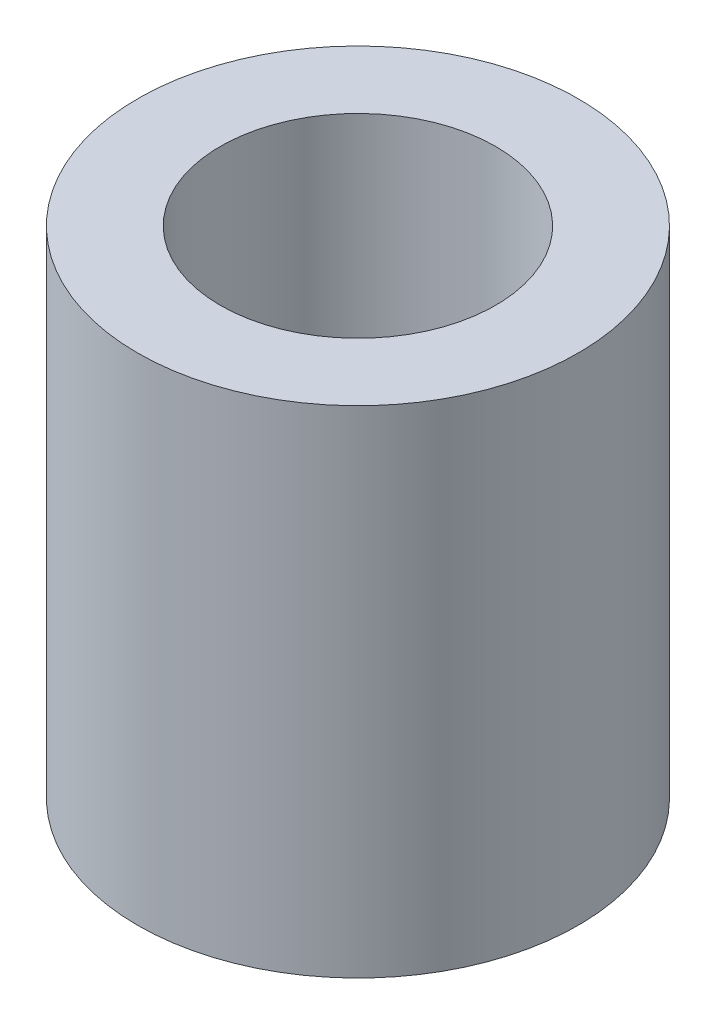
ISO-10303-21;
HEADER;
FILE_DESCRIPTION(('STEP AP214'),'2;1');
FILE_NAME('part.step','',(''),(''),'','','');
FILE_SCHEMA(('AUTOMOTIVE_DESIGN { 1 0 10303 214 1 1 1 1 }'));
ENDSEC;
DATA;
#1=APPLICATION_CONTEXT('core data for automotive mechanical design processes');
#2=APPLICATION_PROTOCOL_DEFINITION('international standard','automotive_design',2000,#1);
#3=PRODUCT_CONTEXT('',#1,'mechanical');
#4=PRODUCT('Part','Part','',(#3));
#5=PRODUCT_RELATED_PRODUCT_CATEGORY('part','',(#4));
#6=PRODUCT_DEFINITION_FORMATION('','',#4);
#7=PRODUCT_DEFINITION_CONTEXT('part definition',#1,'design');
#8=PRODUCT_DEFINITION('design','',#6,#7);
#9=PRODUCT_DEFINITION_SHAPE('','',#8);
#10=(LENGTH_UNIT() NAMED_UNIT(*) SI_UNIT(.MILLI.,.METRE.));
#11=(NAMED_UNIT(*) PLANE_ANGLE_UNIT() SI_UNIT($,.RADIAN.));
#12=(NAMED_UNIT(*) SI_UNIT($,.STERADIAN.) SOLID_ANGLE_UNIT());
#13=UNCERTAINTY_MEASURE_WITH_UNIT(LENGTH_MEASURE(1.E-05),#10,'distance_accuracy_value','');
#14=(GEOMETRIC_REPRESENTATION_CONTEXT(3) GLOBAL_UNCERTAINTY_ASSIGNED_CONTEXT((#13)) GLOBAL_UNIT_ASSIGNED_CONTEXT((#10,
#11,#12)) REPRESENTATION_CONTEXT('',''));
#15=CARTESIAN_POINT('',(0.,0.,0.));
#16=DIRECTION('',(0.,0.,1.));
#17=DIRECTION('',(1.,0.,0.));
#18=AXIS2_PLACEMENT_3D('',#15,#16,#17);
#19=CARTESIAN_POINT('',(0.,22.86,0.));
#20=DIRECTION('',(0.,1.,0.));
#21=DIRECTION('',(0.,0.,1.));
#22=AXIS2_PLACEMENT_3D('',#19,#20,#21);
#23=PLANE('',#22);
#24=CARTESIAN_POINT('',(0.,22.86,0.));
#25=DIRECTION('',(0.,1.,0.));
#26=DIRECTION('',(0.,0.,1.));
#27=AXIS2_PLACEMENT_3D('',#24,#25,#26);
#28=CIRCLE('',#27,10.16);
#29=CARTESIAN_POINT('',(0.,22.86,10.16));
#30=VERTEX_POINT('',#29);
#31=EDGE_CURVE('E10',#30,#30,#28,.T.);
#32=ORIENTED_EDGE('',*,*,#31,.T.);
#33=EDGE_LOOP('',(#32));
#34=FACE_BOUND('',#33,.T.);
#35=CARTESIAN_POINT('',(0.,22.86,0.));
#36=DIRECTION('',(0.,1.,0.));
#37=DIRECTION('',(0.,0.,1.));
#38=AXIS2_PLACEMENT_3D('',#35,#36,#37);
#39=CIRCLE('',#38,6.35);
#40=CARTESIAN_POINT('',(0.,22.86,6.35));
#41=VERTEX_POINT('',#40);
#42=EDGE_CURVE('E44',#41,#41,#39,.T.);
#43=ORIENTED_EDGE('',*,*,#42,.F.);
#44=EDGE_LOOP('',(#43));
#45=FACE_BOUND('',#44,.T.);
#46=ADVANCED_FACE('F33',(#34,#45),#23,.T.);
#47=CARTESIAN_POINT('',(0.,0.,0.));
#48=DIRECTION('',(0.,1.,0.));
#49=DIRECTION('',(0.,0.,1.));
#50=AXIS2_PLACEMENT_3D('',#47,#48,#49);
#51=PLANE('',#50);
#52=CARTESIAN_POINT('',(0.,0.,0.));
#53=DIRECTION('',(0.,1.,0.));
#54=DIRECTION('',(0.,0.,1.));
#55=AXIS2_PLACEMENT_3D('',#52,#53,#54);
#56=CIRCLE('',#55,10.16);
#57=CARTESIAN_POINT('',(0.,0.,10.16));
#58=VERTEX_POINT('',#57);
#59=EDGE_CURVE('E37',#58,#58,#56,.T.);
#60=ORIENTED_EDGE('',*,*,#59,.F.);
#61=EDGE_LOOP('',(#60));
#62=FACE_BOUND('',#61,.T.);
#63=CARTESIAN_POINT('',(0.,0.,0.));
#64=DIRECTION('',(0.,1.,0.));
#65=DIRECTION('',(0.,0.,1.));
#66=AXIS2_PLACEMENT_3D('',#63,#64,#65);
#67=CIRCLE('',#66,6.35);
#68=CARTESIAN_POINT('',(0.,0.,6.35));
#69=VERTEX_POINT('',#68);
#70=EDGE_CURVE('E46',#69,#69,#67,.T.);
#71=ORIENTED_EDGE('',*,*,#70,.T.);
#72=EDGE_LOOP('',(#71));
#73=FACE_BOUND('',#72,.T.);
#74=ADVANCED_FACE('F56',(#62,#73),#51,.F.);
#75=CARTESIAN_POINT('',(0.,22.86,0.));
#76=DIRECTION('',(0.,-1.,0.));
#77=DIRECTION('',(0.,0.,-1.));
#78=AXIS2_PLACEMENT_3D('',#75,#76,#77);
#79=CYLINDRICAL_SURFACE('',#78,10.16);
#80=ORIENTED_EDGE('',*,*,#31,.F.);
#81=EDGE_LOOP('',(#80));
#82=FACE_BOUND('',#81,.T.);
#83=ORIENTED_EDGE('',*,*,#59,.T.);
#84=EDGE_LOOP('',(#83));
#85=FACE_BOUND('',#84,.T.);
#86=ADVANCED_FACE('F35',(#82,#85),#79,.T.);
#87=CARTESIAN_POINT('',(0.,22.86,0.));
#88=DIRECTION('',(0.,-1.,0.));
#89=DIRECTION('',(0.,0.,-1.));
#90=AXIS2_PLACEMENT_3D('',#87,#88,#89);
#91=CYLINDRICAL_SURFACE('',#90,6.35);
#92=ORIENTED_EDGE('',*,*,#42,.T.);
#93=EDGE_LOOP('',(#92));
#94=FACE_BOUND('',#93,.T.);
#95=ORIENTED_EDGE('',*,*,#70,.F.);
#96=EDGE_LOOP('',(#95));
#97=FACE_BOUND('',#96,.T.);
#98=ADVANCED_FACE('F52',(#94,#97),#91,.F.);
#99=CLOSED_SHELL('',(#46,#74,#86,#98));
#100=MANIFOLD_SOLID_BREP('B2',#99);
#101=ADVANCED_BREP_SHAPE_REPRESENTATION('',(#18,#100),#14);
#102=SHAPE_DEFINITION_REPRESENTATION(#9,#101);
ENDSEC;
END-ISO-10303-21;
